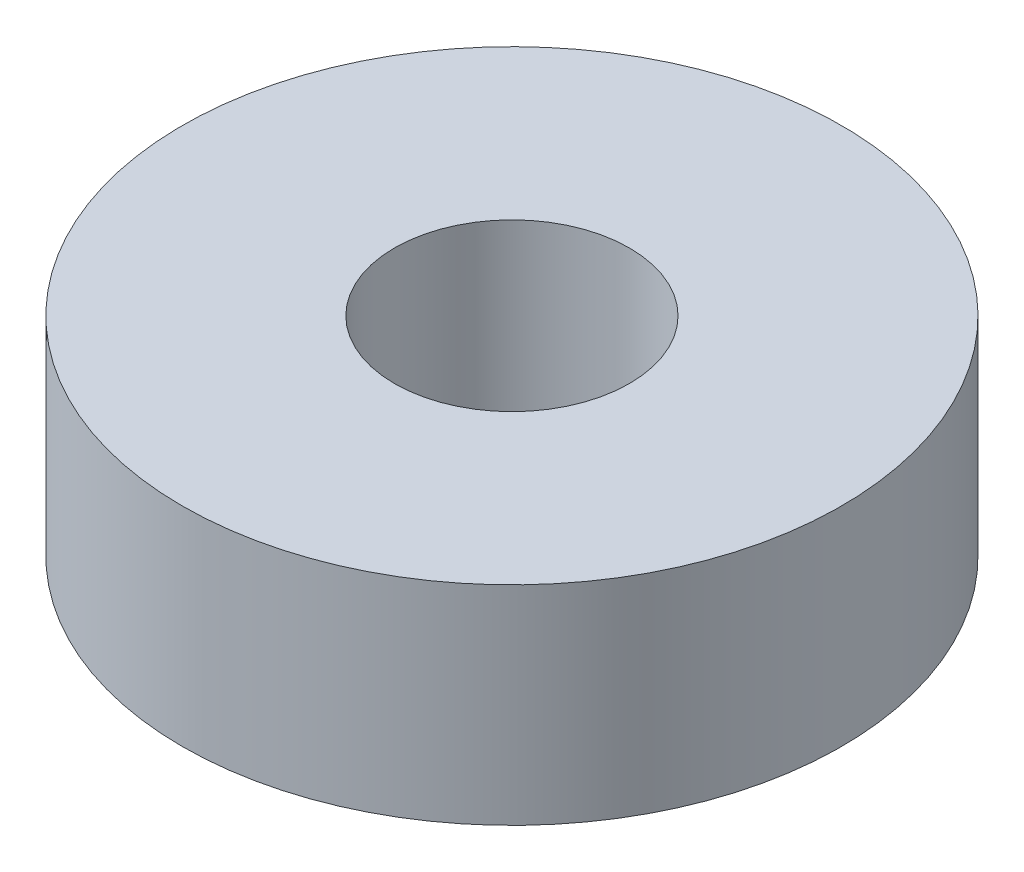
ISO-10303-21;
HEADER;
FILE_DESCRIPTION(('STEP AP214'),'2;1');
FILE_NAME('part.step','',(''),(''),'','','');
FILE_SCHEMA(('AUTOMOTIVE_DESIGN { 1 0 10303 214 1 1 1 1 }'));
ENDSEC;
DATA;
#1=APPLICATION_CONTEXT('core data for automotive mechanical design processes');
#2=APPLICATION_PROTOCOL_DEFINITION('international standard','automotive_design',2000,#1);
#3=PRODUCT_CONTEXT('',#1,'mechanical');
#4=PRODUCT('Part','Part','',(#3));
#5=PRODUCT_RELATED_PRODUCT_CATEGORY('part','',(#4));
#6=PRODUCT_DEFINITION_FORMATION('','',#4);
#7=PRODUCT_DEFINITION_CONTEXT('part definition',#1,'design');
#8=PRODUCT_DEFINITION('design','',#6,#7);
#9=PRODUCT_DEFINITION_SHAPE('','',#8);
#10=(LENGTH_UNIT() NAMED_UNIT(*) SI_UNIT(.MILLI.,.METRE.));
#11=(NAMED_UNIT(*) PLANE_ANGLE_UNIT() SI_UNIT($,.RADIAN.));
#12=(NAMED_UNIT(*) SI_UNIT($,.STERADIAN.) SOLID_ANGLE_UNIT());
#13=UNCERTAINTY_MEASURE_WITH_UNIT(LENGTH_MEASURE(1.E-05),#10,'distance_accuracy_value','');
#14=(GEOMETRIC_REPRESENTATION_CONTEXT(3) GLOBAL_UNCERTAINTY_ASSIGNED_CONTEXT((#13)) GLOBAL_UNIT_ASSIGNED_CONTEXT((#10,
#11,#12)) REPRESENTATION_CONTEXT('',''));
#15=CARTESIAN_POINT('',(0.,0.,0.));
#16=DIRECTION('',(0.,0.,1.));
#17=DIRECTION('',(1.,0.,0.));
#18=AXIS2_PLACEMENT_3D('',#15,#16,#17);
#19=CARTESIAN_POINT('',(0.,6.96,0.));
#20=DIRECTION('',(0.,1.,0.));
#21=DIRECTION('',(0.,0.,1.));
#22=AXIS2_PLACEMENT_3D('',#19,#20,#21);
#23=PLANE('',#22);
#24=CARTESIAN_POINT('',(0.,6.96,0.));
#25=DIRECTION('',(0.,1.,0.));
#26=DIRECTION('',(0.,0.,1.));
#27=AXIS2_PLACEMENT_3D('',#24,#25,#26);
#28=CIRCLE('',#27,11.01);
#29=CARTESIAN_POINT('',(0.,6.96,11.01));
#30=VERTEX_POINT('',#29);
#31=EDGE_CURVE('E10',#30,#30,#28,.T.);
#32=ORIENTED_EDGE('',*,*,#31,.T.);
#33=EDGE_LOOP('',(#32));
#34=FACE_BOUND('',#33,.T.);
#35=CARTESIAN_POINT('',(0.,6.96,0.));
#36=DIRECTION('',(0.,1.,0.));
#37=DIRECTION('',(0.,0.,1.));
#38=AXIS2_PLACEMENT_3D('',#35,#36,#37);
#39=CIRCLE('',#38,3.925);
#40=CARTESIAN_POINT('',(0.,6.96,3.925));
#41=VERTEX_POINT('',#40);
#42=EDGE_CURVE('E42',#41,#41,#39,.T.);
#43=ORIENTED_EDGE('',*,*,#42,.F.);
#44=EDGE_LOOP('',(#43));
#45=FACE_BOUND('',#44,.T.);
#46=ADVANCED_FACE('F31',(#34,#45),#23,.T.);
#47=CARTESIAN_POINT('',(0.,0.,0.));
#48=DIRECTION('',(0.,1.,0.));
#49=DIRECTION('',(0.,0.,1.));
#50=AXIS2_PLACEMENT_3D('',#47,#48,#49);
#51=PLANE('',#50);
#52=CARTESIAN_POINT('',(0.,0.,0.));
#53=DIRECTION('',(0.,1.,0.));
#54=DIRECTION('',(0.,0.,1.));
#55=AXIS2_PLACEMENT_3D('',#52,#53,#54);
#56=CIRCLE('',#55,11.01);
#57=CARTESIAN_POINT('',(0.,0.,11.01));
#58=VERTEX_POINT('',#57);
#59=EDGE_CURVE('E35',#58,#58,#56,.T.);
#60=ORIENTED_EDGE('',*,*,#59,.F.);
#61=EDGE_LOOP('',(#60));
#62=FACE_BOUND('',#61,.T.);
#63=CARTESIAN_POINT('',(0.,0.,0.));
#64=DIRECTION('',(0.,1.,0.));
#65=DIRECTION('',(0.,0.,1.));
#66=AXIS2_PLACEMENT_3D('',#63,#64,#65);
#67=CIRCLE('',#66,3.925);
#68=CARTESIAN_POINT('',(0.,0.,3.925));
#69=VERTEX_POINT('',#68);
#70=EDGE_CURVE('E44',#69,#69,#67,.T.);
#71=ORIENTED_EDGE('',*,*,#70,.T.);
#72=EDGE_LOOP('',(#71));
#73=FACE_BOUND('',#72,.T.);
#74=ADVANCED_FACE('F54',(#62,#73),#51,.F.);
#75=CARTESIAN_POINT('',(0.,6.96,0.));
#76=DIRECTION('',(0.,-1.,0.));
#77=DIRECTION('',(0.,0.,-1.));
#78=AXIS2_PLACEMENT_3D('',#75,#76,#77);
#79=CYLINDRICAL_SURFACE('',#78,11.01);
#80=ORIENTED_EDGE('',*,*,#31,.F.);
#81=EDGE_LOOP('',(#80));
#82=FACE_BOUND('',#81,.T.);
#83=ORIENTED_EDGE('',*,*,#59,.T.);
#84=EDGE_LOOP('',(#83));
#85=FACE_BOUND('',#84,.T.);
#86=ADVANCED_FACE('F33',(#82,#85),#79,.T.);
#87=CARTESIAN_POINT('',(0.,6.96,0.));
#88=DIRECTION('',(0.,-1.,0.));
#89=DIRECTION('',(0.,0.,-1.));
#90=AXIS2_PLACEMENT_3D('',#87,#88,#89);
#91=CYLINDRICAL_SURFACE('',#90,3.925);
#92=ORIENTED_EDGE('',*,*,#42,.T.);
#93=EDGE_LOOP('',(#92));
#94=FACE_BOUND('',#93,.T.);
#95=ORIENTED_EDGE('',*,*,#70,.F.);
#96=EDGE_LOOP('',(#95));
#97=FACE_BOUND('',#96,.T.);
#98=ADVANCED_FACE('F50',(#94,#97),#91,.F.);
#99=CLOSED_SHELL('',(#46,#74,#86,#98));
#100=MANIFOLD_SOLID_BREP('B2',#99);
#101=ADVANCED_BREP_SHAPE_REPRESENTATION('',(#18,#100),#14);
#102=SHAPE_DEFINITION_REPRESENTATION(#9,#101);
ENDSEC;
END-ISO-10303-21;
